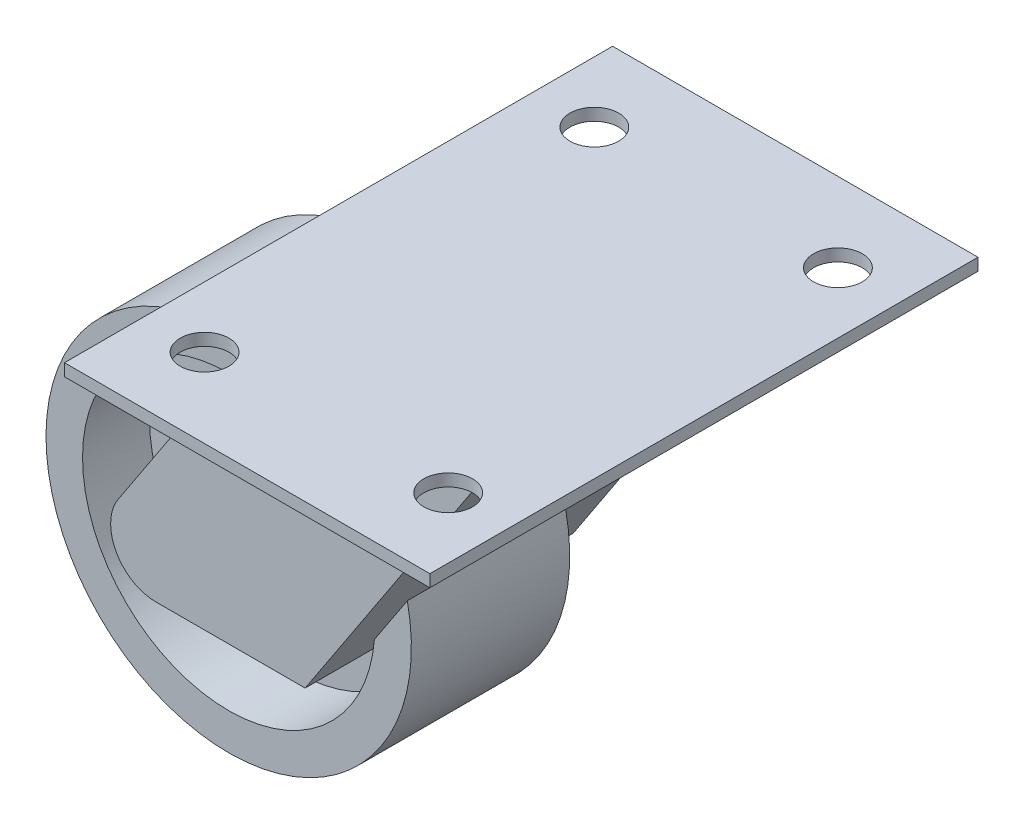
ISO-10303-21;
HEADER;
FILE_DESCRIPTION(('STEP AP214'),'2;1');
FILE_NAME('part.step','',(''),(''),'','','');
FILE_SCHEMA(('AUTOMOTIVE_DESIGN { 1 0 10303 214 1 1 1 1 }'));
ENDSEC;
DATA;
#1=APPLICATION_CONTEXT('core data for automotive mechanical design processes');
#2=APPLICATION_PROTOCOL_DEFINITION('international standard','automotive_design',2000,#1);
#3=PRODUCT_CONTEXT('',#1,'mechanical');
#4=PRODUCT('Part','Part','',(#3));
#5=PRODUCT_RELATED_PRODUCT_CATEGORY('part','',(#4));
#6=PRODUCT_DEFINITION_FORMATION('','',#4);
#7=PRODUCT_DEFINITION_CONTEXT('part definition',#1,'design');
#8=PRODUCT_DEFINITION('design','',#6,#7);
#9=PRODUCT_DEFINITION_SHAPE('','',#8);
#10=(LENGTH_UNIT() NAMED_UNIT(*) SI_UNIT(.MILLI.,.METRE.));
#11=(NAMED_UNIT(*) PLANE_ANGLE_UNIT() SI_UNIT($,.RADIAN.));
#12=(NAMED_UNIT(*) SI_UNIT($,.STERADIAN.) SOLID_ANGLE_UNIT());
#13=UNCERTAINTY_MEASURE_WITH_UNIT(LENGTH_MEASURE(1.E-05),#10,'distance_accuracy_value','');
#14=(GEOMETRIC_REPRESENTATION_CONTEXT(3) GLOBAL_UNCERTAINTY_ASSIGNED_CONTEXT((#13)) GLOBAL_UNIT_ASSIGNED_CONTEXT((#10,
#11,#12)) REPRESENTATION_CONTEXT('',''));
#15=CARTESIAN_POINT('',(0.,0.,0.));
#16=DIRECTION('',(0.,0.,1.));
#17=DIRECTION('',(1.,0.,0.));
#18=AXIS2_PLACEMENT_3D('',#15,#16,#17);
#19=CARTESIAN_POINT('',(10.7769033072078,-2.75667119831269,-11.));
#20=DIRECTION('',(0.835073819861632,-0.550137905785179,0.));
#21=DIRECTION('',(0.550137905785179,0.835073819861632,0.));
#22=AXIS2_PLACEMENT_3D('',#19,#20,#21);
#23=PLANE('',#22);
#24=DIRECTION('',(0.550137905785179,0.835073819861632,0.));
#25=VECTOR('',#24,1.);
#26=CARTESIAN_POINT('',(10.7769033072078,-2.75667119831269,-11.));
#27=LINE('',#26,#25);
#28=CARTESIAN_POINT('',(10.7769033072078,-2.75667119831269,-11.));
#29=VERTEX_POINT('',#28);
#30=CARTESIAN_POINT('',(26.4275500292333,21.,-11.));
#31=VERTEX_POINT('',#30);
#32=EDGE_CURVE('E278',#29,#31,#27,.T.);
#33=ORIENTED_EDGE('',*,*,#32,.T.);
#34=DIRECTION('',(0.,0.,1.));
#35=VECTOR('',#34,1.);
#36=CARTESIAN_POINT('',(26.4275500292333,21.,-11.));
#37=LINE('',#36,#35);
#38=CARTESIAN_POINT('',(26.4275500292333,21.,11.));
#39=VERTEX_POINT('',#38);
#40=EDGE_CURVE('E259',#31,#39,#37,.T.);
#41=ORIENTED_EDGE('',*,*,#40,.T.);
#42=DIRECTION('',(0.550137905785179,0.835073819861632,0.));
#43=VECTOR('',#42,1.);
#44=CARTESIAN_POINT('',(10.7769033072078,-2.75667119831269,11.));
#45=LINE('',#44,#43);
#46=CARTESIAN_POINT('',(10.7769033072078,-2.75667119831269,11.));
#47=VERTEX_POINT('',#46);
#48=EDGE_CURVE('E271',#47,#39,#45,.T.);
#49=ORIENTED_EDGE('',*,*,#48,.F.);
#50=DIRECTION('',(0.,0.,1.));
#51=VECTOR('',#50,1.);
#52=CARTESIAN_POINT('',(10.7769033072078,-2.75667119831269,-11.));
#53=LINE('',#52,#51);
#54=CARTESIAN_POINT('',(10.7769033072078,-2.75667119831269,1.));
#55=VERTEX_POINT('',#54);
#56=EDGE_CURVE('E301',#55,#47,#53,.T.);
#57=ORIENTED_EDGE('',*,*,#56,.F.);
#58=DIRECTION('',(0.550137905785179,0.835073819861632,0.));
#59=VECTOR('',#58,1.);
#60=CARTESIAN_POINT('',(8.78168566842124,-5.78528274744558,1.));
#61=LINE('',#60,#59);
#62=CARTESIAN_POINT('',(11.9616778927944,-0.958259875521329,1.));
#63=VERTEX_POINT('',#62);
#64=EDGE_CURVE('E59',#55,#63,#61,.T.);
#65=ORIENTED_EDGE('',*,*,#64,.T.);
#66=DIRECTION('',(0.,0.,-1.));
#67=VECTOR('',#66,1.);
#68=CARTESIAN_POINT('',(11.9616778927944,-0.958259875521333,6.5));
#69=LINE('',#68,#67);
#70=CARTESIAN_POINT('',(11.9616778927944,-0.958259875521333,6.5));
#71=VERTEX_POINT('',#70);
#72=EDGE_CURVE('E365',#63,#71,#69,.F.);
#73=ORIENTED_EDGE('',*,*,#72,.T.);
#74=DIRECTION('',(0.550137905785179,0.835073819861632,0.));
#75=VECTOR('',#74,1.);
#76=CARTESIAN_POINT('',(8.78168566842124,-5.78528274744558,6.5));
#77=LINE('',#76,#75);
#78=CARTESIAN_POINT('',(14.666168610277,3.14698241096535,6.5));
#79=VERTEX_POINT('',#78);
#80=EDGE_CURVE('E368',#71,#79,#77,.T.);
#81=ORIENTED_EDGE('',*,*,#80,.T.);
#82=DIRECTION('',(0.,0.,-1.));
#83=VECTOR('',#82,1.);
#84=CARTESIAN_POINT('',(14.666168610277,3.14698241096535,6.5));
#85=LINE('',#84,#83);
#86=CARTESIAN_POINT('',(14.666168610277,3.14698241096535,-6.5));
#87=VERTEX_POINT('',#86);
#88=EDGE_CURVE('E371',#87,#79,#85,.F.);
#89=ORIENTED_EDGE('',*,*,#88,.F.);
#90=DIRECTION('',(0.550137905785179,0.835073819861632,0.));
#91=VECTOR('',#90,1.);
#92=CARTESIAN_POINT('',(8.78168566842124,-5.78528274744558,-6.5));
#93=LINE('',#92,#91);
#94=CARTESIAN_POINT('',(11.9616778927944,-0.958259875521329,-6.5));
#95=VERTEX_POINT('',#94);
#96=EDGE_CURVE('E375',#95,#87,#93,.T.);
#97=ORIENTED_EDGE('',*,*,#96,.F.);
#98=DIRECTION('',(0.,0.,-1.));
#99=VECTOR('',#98,1.);
#100=CARTESIAN_POINT('',(11.9616778927944,-0.958259875521333,6.5));
#101=LINE('',#100,#99);
#102=CARTESIAN_POINT('',(11.9616778927944,-0.958259875521333,-1.));
#103=VERTEX_POINT('',#102);
#104=EDGE_CURVE('E379',#95,#103,#101,.F.);
#105=ORIENTED_EDGE('',*,*,#104,.T.);
#106=DIRECTION('',(0.550137905785179,0.835073819861632,0.));
#107=VECTOR('',#106,1.);
#108=CARTESIAN_POINT('',(8.78168566842124,-5.78528274744558,-1.));
#109=LINE('',#108,#107);
#110=CARTESIAN_POINT('',(10.7769033072078,-2.75667119831269,-1.));
#111=VERTEX_POINT('',#110);
#112=EDGE_CURVE('E382',#111,#103,#109,.T.);
#113=ORIENTED_EDGE('',*,*,#112,.F.);
#114=EDGE_CURVE('E296',#29,#111,#53,.T.);
#115=ORIENTED_EDGE('',*,*,#114,.F.);
#116=EDGE_LOOP('',(#33,#41,#49,#57,#65,#73,#81,#89,#97,#105,#113,#115));
#117=FACE_BOUND('',#116,.T.);
#118=ADVANCED_FACE('F50',(#117),#23,.T.);
#119=CARTESIAN_POINT('',(-4.58185860778798,2.97795286723007,-11.));
#120=DIRECTION('',(-0.835073819861632,0.550137905785179,0.));
#121=DIRECTION('',(-0.550137905785179,-0.835073819861632,0.));
#122=AXIS2_PLACEMENT_3D('',#119,#120,#121);
#123=PLANE('',#122);
#124=DIRECTION('',(-0.550137905785179,-0.835073819861632,0.));
#125=VECTOR('',#124,1.);
#126=CARTESIAN_POINT('',(-4.58185860778798,2.97795286723007,11.));
#127=LINE('',#126,#125);
#128=CARTESIAN_POINT('',(7.29087770817826,21.,11.));
#129=VERTEX_POINT('',#128);
#130=CARTESIAN_POINT('',(-4.58185860778798,2.97795286723007,11.));
#131=VERTEX_POINT('',#130);
#132=EDGE_CURVE('E266',#129,#131,#127,.T.);
#133=ORIENTED_EDGE('',*,*,#132,.F.);
#134=DIRECTION('',(0.,0.,-1.));
#135=VECTOR('',#134,1.);
#136=CARTESIAN_POINT('',(7.29087770817826,21.,-11.));
#137=LINE('',#136,#135);
#138=CARTESIAN_POINT('',(7.29087770817826,21.,-11.));
#139=VERTEX_POINT('',#138);
#140=EDGE_CURVE('E66',#129,#139,#137,.T.);
#141=ORIENTED_EDGE('',*,*,#140,.T.);
#142=DIRECTION('',(-0.550137905785179,-0.835073819861632,0.));
#143=VECTOR('',#142,1.);
#144=CARTESIAN_POINT('',(-4.58185860778798,2.97795286723007,-11.));
#145=LINE('',#144,#143);
#146=CARTESIAN_POINT('',(-4.58185860778798,2.97795286723007,-11.));
#147=VERTEX_POINT('',#146);
#148=EDGE_CURVE('E267',#139,#147,#145,.T.);
#149=ORIENTED_EDGE('',*,*,#148,.T.);
#150=DIRECTION('',(0.,0.,1.));
#151=VECTOR('',#150,1.);
#152=CARTESIAN_POINT('',(-4.58185860778798,2.97795286723007,-11.));
#153=LINE('',#152,#151);
#154=CARTESIAN_POINT('',(-4.58185860778798,2.97795286723007,-1.));
#155=VERTEX_POINT('',#154);
#156=EDGE_CURVE('E305',#147,#155,#153,.T.);
#157=ORIENTED_EDGE('',*,*,#156,.T.);
#158=DIRECTION('',(-0.550137905785179,-0.835073819861632,0.));
#159=VECTOR('',#158,1.);
#160=CARTESIAN_POINT('',(-4.56323994796898,3.00621479067191,-1.));
#161=LINE('',#160,#159);
#162=CARTESIAN_POINT('',(1.31421865650546,11.927817458483,-1.));
#163=VERTEX_POINT('',#162);
#164=EDGE_CURVE('E361',#163,#155,#161,.T.);
#165=ORIENTED_EDGE('',*,*,#164,.F.);
#166=DIRECTION('',(0.,0.,-1.));
#167=VECTOR('',#166,1.);
#168=CARTESIAN_POINT('',(1.31421865650546,11.927817458483,6.5));
#169=LINE('',#168,#167);
#170=CARTESIAN_POINT('',(1.31421865650547,11.927817458483,-6.5));
#171=VERTEX_POINT('',#170);
#172=EDGE_CURVE('E358',#163,#171,#169,.T.);
#173=ORIENTED_EDGE('',*,*,#172,.T.);
#174=DIRECTION('',(-0.550137905785179,-0.835073819861632,0.));
#175=VECTOR('',#174,1.);
#176=CARTESIAN_POINT('',(-4.56323994796898,3.00621479067191,-6.5));
#177=LINE('',#176,#175);
#178=CARTESIAN_POINT('',(3.12176549075575,14.6715568437956,-6.5));
#179=VERTEX_POINT('',#178);
#180=EDGE_CURVE('E354',#179,#171,#177,.T.);
#181=ORIENTED_EDGE('',*,*,#180,.F.);
#182=DIRECTION('',(0.,0.,-1.));
#183=VECTOR('',#182,1.);
#184=CARTESIAN_POINT('',(3.12176549075575,14.6715568437956,6.5));
#185=LINE('',#184,#183);
#186=CARTESIAN_POINT('',(3.12176549075575,14.6715568437956,6.5));
#187=VERTEX_POINT('',#186);
#188=EDGE_CURVE('E350',#187,#179,#185,.T.);
#189=ORIENTED_EDGE('',*,*,#188,.F.);
#190=DIRECTION('',(-0.550137905785179,-0.835073819861632,0.));
#191=VECTOR('',#190,1.);
#192=CARTESIAN_POINT('',(-4.56323994796898,3.00621479067191,6.5));
#193=LINE('',#192,#191);
#194=CARTESIAN_POINT('',(1.31421865650546,11.927817458483,6.5));
#195=VERTEX_POINT('',#194);
#196=EDGE_CURVE('E347',#187,#195,#193,.T.);
#197=ORIENTED_EDGE('',*,*,#196,.T.);
#198=DIRECTION('',(0.,0.,-1.));
#199=VECTOR('',#198,1.);
#200=CARTESIAN_POINT('',(1.31421865650546,11.927817458483,6.5));
#201=LINE('',#200,#199);
#202=CARTESIAN_POINT('',(1.31421865650547,11.927817458483,1.));
#203=VERTEX_POINT('',#202);
#204=EDGE_CURVE('E344',#195,#203,#201,.T.);
#205=ORIENTED_EDGE('',*,*,#204,.T.);
#206=DIRECTION('',(-0.550137905785179,-0.835073819861632,0.));
#207=VECTOR('',#206,1.);
#208=CARTESIAN_POINT('',(-4.56323994796898,3.00621479067191,1.));
#209=LINE('',#208,#207);
#210=CARTESIAN_POINT('',(-4.58185860778798,2.97795286723007,1.));
#211=VERTEX_POINT('',#210);
#212=EDGE_CURVE('E434',#203,#211,#209,.T.);
#213=ORIENTED_EDGE('',*,*,#212,.T.);
#214=EDGE_CURVE('E282',#211,#131,#153,.T.);
#215=ORIENTED_EDGE('',*,*,#214,.T.);
#216=EDGE_LOOP('',(#133,#141,#149,#157,#165,#173,#181,#189,#197,#205,#213,#215));
#217=FACE_BOUND('',#216,.T.);
#218=ADVANCED_FACE('F457',(#217),#123,.T.);
#219=CARTESIAN_POINT('',(0.,0.,-11.));
#220=DIRECTION('',(0.,0.,1.));
#221=DIRECTION('',(1.,0.,0.));
#222=AXIS2_PLACEMENT_3D('',#219,#220,#221);
#223=PLANE('',#222);
#224=DIRECTION('',(-1.,0.,0.));
#225=VECTOR('',#224,1.);
#226=CARTESIAN_POINT('',(0.,21.,-11.));
#227=LINE('',#226,#225);
#228=EDGE_CURVE('E263',#31,#139,#227,.T.);
#229=ORIENTED_EDGE('',*,*,#228,.F.);
#230=ORIENTED_EDGE('',*,*,#32,.F.);
#231=DIRECTION('',(1.,0.,0.));
#232=VECTOR('',#231,1.);
#233=CARTESIAN_POINT('',(-1.49256287093057,-2.75667119831269,-11.));
#234=LINE('',#233,#232);
#235=CARTESIAN_POINT('',(-1.49256287093057,-2.75667119831269,-11.));
#236=VERTEX_POINT('',#235);
#237=EDGE_CURVE('E274',#236,#29,#234,.T.);
#238=ORIENTED_EDGE('',*,*,#237,.F.);
#239=CARTESIAN_POINT('',(-1.49256287093057,0.94275711973624,-11.));
#240=DIRECTION('',(0.,0.,1.));
#241=DIRECTION('',(-1.,0.,0.));
#242=AXIS2_PLACEMENT_3D('',#239,#240,#241);
#243=CIRCLE('',#242,3.69942831804893);
#244=EDGE_CURVE('E270',#147,#236,#243,.T.);
#245=ORIENTED_EDGE('',*,*,#244,.F.);
#246=ORIENTED_EDGE('',*,*,#148,.F.);
#247=EDGE_LOOP('',(#229,#230,#238,#245,#246));
#248=FACE_BOUND('',#247,.T.);
#249=ADVANCED_FACE('F474',(#248),#223,.F.);
#250=CARTESIAN_POINT('',(0.,0.,11.));
#251=DIRECTION('',(0.,0.,1.));
#252=DIRECTION('',(1.,0.,0.));
#253=AXIS2_PLACEMENT_3D('',#250,#251,#252);
#254=PLANE('',#253);
#255=ORIENTED_EDGE('',*,*,#48,.T.);
#256=DIRECTION('',(-1.,0.,0.));
#257=VECTOR('',#256,1.);
#258=CARTESIAN_POINT('',(0.,21.,11.));
#259=LINE('',#258,#257);
#260=EDGE_CURVE('E12',#39,#129,#259,.T.);
#261=ORIENTED_EDGE('',*,*,#260,.T.);
#262=ORIENTED_EDGE('',*,*,#132,.T.);
#263=CARTESIAN_POINT('',(-1.49256287093057,0.94275711973624,11.));
#264=DIRECTION('',(0.,0.,1.));
#265=DIRECTION('',(-1.,0.,0.));
#266=AXIS2_PLACEMENT_3D('',#263,#264,#265);
#267=CIRCLE('',#266,3.69942831804893);
#268=CARTESIAN_POINT('',(-1.49256287093057,-2.75667119831269,11.));
#269=VERTEX_POINT('',#268);
#270=EDGE_CURVE('E285',#131,#269,#267,.T.);
#271=ORIENTED_EDGE('',*,*,#270,.T.);
#272=DIRECTION('',(1.,0.,0.));
#273=VECTOR('',#272,1.);
#274=CARTESIAN_POINT('',(-1.49256287093057,-2.75667119831269,11.));
#275=LINE('',#274,#273);
#276=EDGE_CURVE('E289',#269,#47,#275,.T.);
#277=ORIENTED_EDGE('',*,*,#276,.T.);
#278=EDGE_LOOP('',(#255,#261,#262,#271,#277));
#279=FACE_BOUND('',#278,.T.);
#280=ADVANCED_FACE('F469',(#279),#254,.T.);
#281=CARTESIAN_POINT('',(0.,0.,6.5));
#282=DIRECTION('',(0.,0.,-1.));
#283=DIRECTION('',(-1.,0.,0.));
#284=AXIS2_PLACEMENT_3D('',#281,#282,#283);
#285=CYLINDRICAL_SURFACE('',#284,12.);
#286=ORIENTED_EDGE('',*,*,#104,.F.);
#287=CARTESIAN_POINT('',(0.,0.,-6.5));
#288=DIRECTION('',(0.,0.,1.));
#289=DIRECTION('',(1.,0.,0.));
#290=AXIS2_PLACEMENT_3D('',#287,#288,#289);
#291=CIRCLE('',#290,12.);
#292=EDGE_CURVE('E406',#171,#95,#291,.T.);
#293=ORIENTED_EDGE('',*,*,#292,.F.);
#294=ORIENTED_EDGE('',*,*,#172,.F.);
#295=CARTESIAN_POINT('',(0.,0.,-1.));
#296=DIRECTION('',(0.,0.,1.));
#297=DIRECTION('',(1.,0.,0.));
#298=AXIS2_PLACEMENT_3D('',#295,#296,#297);
#299=CIRCLE('',#298,12.);
#300=EDGE_CURVE('E410',#163,#103,#299,.T.);
#301=ORIENTED_EDGE('',*,*,#300,.T.);
#302=EDGE_LOOP('',(#286,#293,#294,#301));
#303=FACE_BOUND('',#302,.T.);
#304=ADVANCED_FACE('F519',(#303),#285,.F.);
#305=CARTESIAN_POINT('',(0.,0.,6.5));
#306=DIRECTION('',(0.,0.,1.));
#307=DIRECTION('',(1.,0.,0.));
#308=AXIS2_PLACEMENT_3D('',#305,#306,#307);
#309=PLANE('',#308);
#310=ORIENTED_EDGE('',*,*,#80,.F.);
#311=CARTESIAN_POINT('',(0.,0.,6.5));
#312=DIRECTION('',(0.,0.,1.));
#313=DIRECTION('',(1.,0.,0.));
#314=AXIS2_PLACEMENT_3D('',#311,#312,#313);
#315=CIRCLE('',#314,12.);
#316=EDGE_CURVE('E401',#195,#71,#315,.T.);
#317=ORIENTED_EDGE('',*,*,#316,.F.);
#318=ORIENTED_EDGE('',*,*,#196,.F.);
#319=CARTESIAN_POINT('',(0.,0.,6.5));
#320=DIRECTION('',(0.,0.,1.));
#321=DIRECTION('',(1.,0.,0.));
#322=AXIS2_PLACEMENT_3D('',#319,#320,#321);
#323=CIRCLE('',#322,15.);
#324=EDGE_CURVE('E411',#187,#79,#323,.T.);
#325=ORIENTED_EDGE('',*,*,#324,.T.);
#326=EDGE_LOOP('',(#310,#317,#318,#325));
#327=FACE_BOUND('',#326,.T.);
#328=ADVANCED_FACE('F541',(#327),#309,.T.);
#329=CARTESIAN_POINT('',(0.,0.,-6.5));
#330=DIRECTION('',(0.,0.,1.));
#331=DIRECTION('',(1.,0.,0.));
#332=AXIS2_PLACEMENT_3D('',#329,#330,#331);
#333=PLANE('',#332);
#334=ORIENTED_EDGE('',*,*,#292,.T.);
#335=ORIENTED_EDGE('',*,*,#96,.T.);
#336=CARTESIAN_POINT('',(0.,0.,-6.5));
#337=DIRECTION('',(0.,0.,1.));
#338=DIRECTION('',(1.,0.,0.));
#339=AXIS2_PLACEMENT_3D('',#336,#337,#338);
#340=CIRCLE('',#339,15.);
#341=EDGE_CURVE('E405',#179,#87,#340,.T.);
#342=ORIENTED_EDGE('',*,*,#341,.F.);
#343=ORIENTED_EDGE('',*,*,#180,.T.);
#344=EDGE_LOOP('',(#334,#335,#342,#343));
#345=FACE_BOUND('',#344,.T.);
#346=ADVANCED_FACE('F543',(#345),#333,.F.);
#347=CARTESIAN_POINT('',(0.,0.,6.5));
#348=DIRECTION('',(0.,0.,-1.));
#349=DIRECTION('',(-1.,0.,0.));
#350=AXIS2_PLACEMENT_3D('',#347,#348,#349);
#351=CYLINDRICAL_SURFACE('',#350,15.);
#352=ORIENTED_EDGE('',*,*,#341,.T.);
#353=ORIENTED_EDGE('',*,*,#88,.T.);
#354=ORIENTED_EDGE('',*,*,#324,.F.);
#355=ORIENTED_EDGE('',*,*,#188,.T.);
#356=EDGE_LOOP('',(#352,#353,#354,#355));
#357=FACE_BOUND('',#356,.T.);
#358=ADVANCED_FACE('F52',(#357),#351,.T.);
#359=ORIENTED_EDGE('',*,*,#72,.F.);
#360=CARTESIAN_POINT('',(0.,0.,1.));
#361=DIRECTION('',(0.,0.,1.));
#362=DIRECTION('',(1.,0.,0.));
#363=AXIS2_PLACEMENT_3D('',#360,#361,#362);
#364=CIRCLE('',#363,12.);
#365=EDGE_CURVE('E400',#203,#63,#364,.T.);
#366=ORIENTED_EDGE('',*,*,#365,.F.);
#367=ORIENTED_EDGE('',*,*,#204,.F.);
#368=ORIENTED_EDGE('',*,*,#316,.T.);
#369=EDGE_LOOP('',(#359,#366,#367,#368));
#370=FACE_BOUND('',#369,.T.);
#371=ADVANCED_FACE('F447',(#370),#285,.F.);
#372=CARTESIAN_POINT('',(0.,0.,-1.));
#373=DIRECTION('',(0.,0.,1.));
#374=DIRECTION('',(1.,0.,0.));
#375=AXIS2_PLACEMENT_3D('',#372,#373,#374);
#376=PLANE('',#375);
#377=DIRECTION('',(1.,0.,0.));
#378=VECTOR('',#377,1.);
#379=CARTESIAN_POINT('',(0.,-2.75667119831269,-1.));
#380=LINE('',#379,#378);
#381=CARTESIAN_POINT('',(4.17142228794847,-2.75667119831269,-1.));
#382=VERTEX_POINT('',#381);
#383=EDGE_CURVE('E330',#382,#111,#380,.T.);
#384=ORIENTED_EDGE('',*,*,#383,.T.);
#385=ORIENTED_EDGE('',*,*,#112,.T.);
#386=ORIENTED_EDGE('',*,*,#300,.F.);
#387=ORIENTED_EDGE('',*,*,#164,.T.);
#388=CARTESIAN_POINT('',(-1.49256287093057,0.94275711973624,-1.));
#389=DIRECTION('',(0.,0.,1.));
#390=DIRECTION('',(1.,0.,0.));
#391=AXIS2_PLACEMENT_3D('',#388,#389,#390);
#392=CIRCLE('',#391,3.69942831804893);
#393=CARTESIAN_POINT('',(-4.99362707825869,-0.252366010551265,-1.));
#394=VERTEX_POINT('',#393);
#395=EDGE_CURVE('E312',#155,#394,#392,.T.);
#396=ORIENTED_EDGE('',*,*,#395,.T.);
#397=CARTESIAN_POINT('',(0.,0.,-1.));
#398=DIRECTION('',(0.,0.,1.));
#399=DIRECTION('',(1.,0.,0.));
#400=AXIS2_PLACEMENT_3D('',#397,#398,#399);
#401=CIRCLE('',#400,5.);
#402=EDGE_CURVE('E395',#382,#394,#401,.F.);
#403=ORIENTED_EDGE('',*,*,#402,.F.);
#404=EDGE_LOOP('',(#384,#385,#386,#387,#396,#403));
#405=FACE_BOUND('',#404,.T.);
#406=ADVANCED_FACE('F481',(#405),#376,.F.);
#407=CARTESIAN_POINT('',(0.,0.,1.));
#408=DIRECTION('',(0.,0.,1.));
#409=DIRECTION('',(1.,0.,0.));
#410=AXIS2_PLACEMENT_3D('',#407,#408,#409);
#411=PLANE('',#410);
#412=ORIENTED_EDGE('',*,*,#64,.F.);
#413=DIRECTION('',(1.,0.,0.));
#414=VECTOR('',#413,1.);
#415=CARTESIAN_POINT('',(0.,-2.75667119831269,1.));
#416=LINE('',#415,#414);
#417=CARTESIAN_POINT('',(4.17142228794847,-2.75667119831269,1.));
#418=VERTEX_POINT('',#417);
#419=EDGE_CURVE('E341',#418,#55,#416,.T.);
#420=ORIENTED_EDGE('',*,*,#419,.F.);
#421=CARTESIAN_POINT('',(0.,0.,1.));
#422=DIRECTION('',(0.,0.,1.));
#423=DIRECTION('',(1.,0.,0.));
#424=AXIS2_PLACEMENT_3D('',#421,#422,#423);
#425=CIRCLE('',#424,5.);
#426=CARTESIAN_POINT('',(-4.99362707825869,-0.252366010551265,1.));
#427=VERTEX_POINT('',#426);
#428=EDGE_CURVE('E391',#418,#427,#425,.F.);
#429=ORIENTED_EDGE('',*,*,#428,.T.);
#430=CARTESIAN_POINT('',(-1.49256287093057,0.94275711973624,1.));
#431=DIRECTION('',(0.,0.,1.));
#432=DIRECTION('',(1.,0.,0.));
#433=AXIS2_PLACEMENT_3D('',#430,#431,#432);
#434=CIRCLE('',#433,3.69942831804893);
#435=EDGE_CURVE('E323',#211,#427,#434,.T.);
#436=ORIENTED_EDGE('',*,*,#435,.F.);
#437=ORIENTED_EDGE('',*,*,#212,.F.);
#438=ORIENTED_EDGE('',*,*,#365,.T.);
#439=EDGE_LOOP('',(#412,#420,#429,#436,#437,#438));
#440=FACE_BOUND('',#439,.T.);
#441=ADVANCED_FACE('F451',(#440),#411,.T.);
#442=CARTESIAN_POINT('',(0.,0.,6.5));
#443=DIRECTION('',(0.,0.,1.));
#444=DIRECTION('',(1.,0.,0.));
#445=AXIS2_PLACEMENT_3D('',#442,#443,#444);
#446=PLANE('',#445);
#447=DIRECTION('',(1.,0.,0.));
#448=VECTOR('',#447,1.);
#449=CARTESIAN_POINT('',(0.,-2.75667119831269,6.5));
#450=LINE('',#449,#448);
#451=CARTESIAN_POINT('',(-1.49256287093057,-2.75667119831269,6.5));
#452=VERTEX_POINT('',#451);
#453=CARTESIAN_POINT('',(4.17142228794847,-2.75667119831269,6.5));
#454=VERTEX_POINT('',#453);
#455=EDGE_CURVE('E338',#452,#454,#450,.T.);
#456=ORIENTED_EDGE('',*,*,#455,.F.);
#457=CARTESIAN_POINT('',(-1.49256287093057,0.94275711973624,6.5));
#458=DIRECTION('',(0.,0.,1.));
#459=DIRECTION('',(1.,0.,0.));
#460=AXIS2_PLACEMENT_3D('',#457,#458,#459);
#461=CIRCLE('',#460,3.69942831804893);
#462=CARTESIAN_POINT('',(-4.99362707825869,-0.252366010551265,6.5));
#463=VERTEX_POINT('',#462);
#464=EDGE_CURVE('E320',#463,#452,#461,.T.);
#465=ORIENTED_EDGE('',*,*,#464,.F.);
#466=CARTESIAN_POINT('',(0.,0.,6.5));
#467=DIRECTION('',(0.,0.,1.));
#468=DIRECTION('',(1.,0.,0.));
#469=AXIS2_PLACEMENT_3D('',#466,#467,#468);
#470=CIRCLE('',#469,5.);
#471=EDGE_CURVE('E387',#463,#454,#470,.T.);
#472=ORIENTED_EDGE('',*,*,#471,.T.);
#473=EDGE_LOOP('',(#456,#465,#472));
#474=FACE_BOUND('',#473,.T.);
#475=ADVANCED_FACE('F521',(#474),#446,.T.);
#476=CARTESIAN_POINT('',(0.,0.,6.5));
#477=DIRECTION('',(0.,0.,-1.));
#478=DIRECTION('',(-1.,0.,0.));
#479=AXIS2_PLACEMENT_3D('',#476,#477,#478);
#480=CYLINDRICAL_SURFACE('',#479,5.);
#481=ORIENTED_EDGE('',*,*,#428,.F.);
#482=DIRECTION('',(0.,0.,-1.));
#483=VECTOR('',#482,1.);
#484=CARTESIAN_POINT('',(4.17142228794847,-2.75667119831269,6.5));
#485=LINE('',#484,#483);
#486=EDGE_CURVE('E334',#418,#454,#485,.F.);
#487=ORIENTED_EDGE('',*,*,#486,.T.);
#488=ORIENTED_EDGE('',*,*,#471,.F.);
#489=DIRECTION('',(0.,0.,1.));
#490=VECTOR('',#489,1.);
#491=CARTESIAN_POINT('',(-4.99362707825869,-0.252366010551265,0.));
#492=LINE('',#491,#490);
#493=EDGE_CURVE('E316',#463,#427,#492,.F.);
#494=ORIENTED_EDGE('',*,*,#493,.T.);
#495=EDGE_LOOP('',(#481,#487,#488,#494));
#496=FACE_BOUND('',#495,.T.);
#497=ADVANCED_FACE('F497',(#496),#480,.T.);
#498=CARTESIAN_POINT('',(0.,0.,-6.5));
#499=DIRECTION('',(0.,0.,1.));
#500=DIRECTION('',(1.,0.,0.));
#501=AXIS2_PLACEMENT_3D('',#498,#499,#500);
#502=CIRCLE('',#501,5.);
#503=CARTESIAN_POINT('',(-4.99362707825869,-0.252366010551265,-6.5));
#504=VERTEX_POINT('',#503);
#505=CARTESIAN_POINT('',(4.17142228794848,-2.75667119831269,-6.5));
#506=VERTEX_POINT('',#505);
#507=EDGE_CURVE('E386',#504,#506,#502,.T.);
#508=ORIENTED_EDGE('',*,*,#507,.T.);
#509=DIRECTION('',(0.,0.,-1.));
#510=VECTOR('',#509,1.);
#511=CARTESIAN_POINT('',(4.17142228794847,-2.75667119831269,6.5));
#512=LINE('',#511,#510);
#513=EDGE_CURVE('E326',#506,#382,#512,.F.);
#514=ORIENTED_EDGE('',*,*,#513,.T.);
#515=ORIENTED_EDGE('',*,*,#402,.T.);
#516=DIRECTION('',(0.,0.,1.));
#517=VECTOR('',#516,1.);
#518=CARTESIAN_POINT('',(-4.99362707825869,-0.252366010551265,0.));
#519=LINE('',#518,#517);
#520=EDGE_CURVE('E300',#394,#504,#519,.F.);
#521=ORIENTED_EDGE('',*,*,#520,.T.);
#522=EDGE_LOOP('',(#508,#514,#515,#521));
#523=FACE_BOUND('',#522,.T.);
#524=ADVANCED_FACE('F484',(#523),#480,.T.);
#525=CARTESIAN_POINT('',(0.,0.,-6.5));
#526=DIRECTION('',(0.,0.,1.));
#527=DIRECTION('',(1.,0.,0.));
#528=AXIS2_PLACEMENT_3D('',#525,#526,#527);
#529=PLANE('',#528);
#530=CARTESIAN_POINT('',(-1.49256287093057,0.94275711973624,-6.5));
#531=DIRECTION('',(0.,0.,1.));
#532=DIRECTION('',(1.,0.,0.));
#533=AXIS2_PLACEMENT_3D('',#530,#531,#532);
#534=CIRCLE('',#533,3.69942831804893);
#535=CARTESIAN_POINT('',(-1.49256287093057,-2.75667119831269,-6.5));
#536=VERTEX_POINT('',#535);
#537=EDGE_CURVE('E399',#504,#536,#534,.T.);
#538=ORIENTED_EDGE('',*,*,#537,.T.);
#539=DIRECTION('',(1.,0.,0.));
#540=VECTOR('',#539,1.);
#541=CARTESIAN_POINT('',(0.,-2.75667119831269,-6.5));
#542=LINE('',#541,#540);
#543=EDGE_CURVE('E430',#536,#506,#542,.T.);
#544=ORIENTED_EDGE('',*,*,#543,.T.);
#545=ORIENTED_EDGE('',*,*,#507,.F.);
#546=EDGE_LOOP('',(#538,#544,#545));
#547=FACE_BOUND('',#546,.T.);
#548=ADVANCED_FACE('F489',(#547),#529,.F.);
#549=CARTESIAN_POINT('',(-1.49256287093057,-2.75667119831269,-11.));
#550=DIRECTION('',(0.,-1.,0.));
#551=DIRECTION('',(0.,0.,-1.));
#552=AXIS2_PLACEMENT_3D('',#549,#550,#551);
#553=PLANE('',#552);
#554=ORIENTED_EDGE('',*,*,#383,.F.);
#555=ORIENTED_EDGE('',*,*,#513,.F.);
#556=ORIENTED_EDGE('',*,*,#543,.F.);
#557=DIRECTION('',(0.,0.,1.));
#558=VECTOR('',#557,1.);
#559=CARTESIAN_POINT('',(-1.49256287093057,-2.75667119831269,-11.));
#560=LINE('',#559,#558);
#561=EDGE_CURVE('E73',#236,#536,#560,.T.);
#562=ORIENTED_EDGE('',*,*,#561,.F.);
#563=ORIENTED_EDGE('',*,*,#237,.T.);
#564=ORIENTED_EDGE('',*,*,#114,.T.);
#565=EDGE_LOOP('',(#554,#555,#556,#562,#563,#564));
#566=FACE_BOUND('',#565,.T.);
#567=ADVANCED_FACE('F487',(#566),#553,.T.);
#568=CARTESIAN_POINT('',(-1.49256287093057,0.94275711973624,-11.));
#569=DIRECTION('',(0.,0.,1.));
#570=DIRECTION('',(1.,0.,0.));
#571=AXIS2_PLACEMENT_3D('',#568,#569,#570);
#572=CYLINDRICAL_SURFACE('',#571,3.69942831804893);
#573=ORIENTED_EDGE('',*,*,#395,.F.);
#574=ORIENTED_EDGE('',*,*,#156,.F.);
#575=ORIENTED_EDGE('',*,*,#244,.T.);
#576=ORIENTED_EDGE('',*,*,#561,.T.);
#577=ORIENTED_EDGE('',*,*,#537,.F.);
#578=ORIENTED_EDGE('',*,*,#520,.F.);
#579=EDGE_LOOP('',(#573,#574,#575,#576,#577,#578));
#580=FACE_BOUND('',#579,.T.);
#581=ADVANCED_FACE('F478',(#580),#572,.T.);
#582=ORIENTED_EDGE('',*,*,#486,.F.);
#583=ORIENTED_EDGE('',*,*,#419,.T.);
#584=ORIENTED_EDGE('',*,*,#56,.T.);
#585=ORIENTED_EDGE('',*,*,#276,.F.);
#586=EDGE_CURVE('E304',#452,#269,#560,.T.);
#587=ORIENTED_EDGE('',*,*,#586,.F.);
#588=ORIENTED_EDGE('',*,*,#455,.T.);
#589=EDGE_LOOP('',(#582,#583,#584,#585,#587,#588));
#590=FACE_BOUND('',#589,.T.);
#591=ADVANCED_FACE('F466',(#590),#553,.T.);
#592=ORIENTED_EDGE('',*,*,#214,.F.);
#593=ORIENTED_EDGE('',*,*,#435,.T.);
#594=ORIENTED_EDGE('',*,*,#493,.F.);
#595=ORIENTED_EDGE('',*,*,#464,.T.);
#596=ORIENTED_EDGE('',*,*,#586,.T.);
#597=ORIENTED_EDGE('',*,*,#270,.F.);
#598=EDGE_LOOP('',(#592,#593,#594,#595,#596,#597));
#599=FACE_BOUND('',#598,.T.);
#600=ADVANCED_FACE('F460',(#599),#572,.T.);
#601=CARTESIAN_POINT('',(0.,21.,0.));
#602=DIRECTION('',(0.,1.,0.));
#603=DIRECTION('',(0.,0.,1.));
#604=AXIS2_PLACEMENT_3D('',#601,#602,#603);
#605=PLANE('',#604);
#606=CARTESIAN_POINT('',(27.5196672579169,21.,16.));
#607=DIRECTION('',(0.,1.,0.));
#608=DIRECTION('',(0.,0.,-1.));
#609=AXIS2_PLACEMENT_3D('',#606,#607,#608);
#610=CIRCLE('',#609,2.);
#611=CARTESIAN_POINT('',(27.5196672579169,21.,14.));
#612=VERTEX_POINT('',#611);
#613=EDGE_CURVE('E843',#612,#612,#610,.T.);
#614=ORIENTED_EDGE('',*,*,#613,.T.);
#615=EDGE_LOOP('',(#614));
#616=FACE_BOUND('',#615,.T.);
#617=CARTESIAN_POINT('',(7.51966725791692,21.,16.));
#618=DIRECTION('',(0.,1.,0.));
#619=DIRECTION('',(0.,0.,1.));
#620=AXIS2_PLACEMENT_3D('',#617,#618,#619);
#621=CIRCLE('',#620,2.);
#622=CARTESIAN_POINT('',(7.51966725791692,21.,18.));
#623=VERTEX_POINT('',#622);
#624=EDGE_CURVE('E854',#623,#623,#621,.T.);
#625=ORIENTED_EDGE('',*,*,#624,.T.);
#626=EDGE_LOOP('',(#625));
#627=FACE_BOUND('',#626,.T.);
#628=CARTESIAN_POINT('',(7.51966725791692,21.,-16.));
#629=DIRECTION('',(0.,1.,0.));
#630=DIRECTION('',(0.,0.,-1.));
#631=AXIS2_PLACEMENT_3D('',#628,#629,#630);
#632=CIRCLE('',#631,2.);
#633=CARTESIAN_POINT('',(7.51966725791692,21.,-18.));
#634=VERTEX_POINT('',#633);
#635=EDGE_CURVE('E862',#634,#634,#632,.T.);
#636=ORIENTED_EDGE('',*,*,#635,.T.);
#637=EDGE_LOOP('',(#636));
#638=FACE_BOUND('',#637,.T.);
#639=CARTESIAN_POINT('',(27.5196672579169,21.,-16.));
#640=DIRECTION('',(0.,1.,0.));
#641=DIRECTION('',(0.,0.,1.));
#642=AXIS2_PLACEMENT_3D('',#639,#640,#641);
#643=CIRCLE('',#642,2.);
#644=CARTESIAN_POINT('',(27.5196672579169,21.,-14.));
#645=VERTEX_POINT('',#644);
#646=EDGE_CURVE('E244',#645,#645,#643,.T.);
#647=ORIENTED_EDGE('',*,*,#646,.T.);
#648=EDGE_LOOP('',(#647));
#649=FACE_BOUND('',#648,.T.);
#650=DIRECTION('',(0.,0.,1.));
#651=VECTOR('',#650,1.);
#652=CARTESIAN_POINT('',(2.51966725791691,21.,22.5));
#653=LINE('',#652,#651);
#654=CARTESIAN_POINT('',(2.51966725791691,21.,-22.5));
#655=VERTEX_POINT('',#654);
#656=CARTESIAN_POINT('',(2.51966725791691,21.,22.5));
#657=VERTEX_POINT('',#656);
#658=EDGE_CURVE('E218',#655,#657,#653,.T.);
#659=ORIENTED_EDGE('',*,*,#658,.F.);
#660=DIRECTION('',(-1.,0.,0.));
#661=VECTOR('',#660,1.);
#662=CARTESIAN_POINT('',(32.5196672579169,21.,-22.5));
#663=LINE('',#662,#661);
#664=CARTESIAN_POINT('',(32.5196672579169,21.,-22.5));
#665=VERTEX_POINT('',#664);
#666=EDGE_CURVE('E211',#665,#655,#663,.T.);
#667=ORIENTED_EDGE('',*,*,#666,.F.);
#668=DIRECTION('',(0.,0.,-1.));
#669=VECTOR('',#668,1.);
#670=CARTESIAN_POINT('',(32.5196672579169,21.,22.5));
#671=LINE('',#670,#669);
#672=CARTESIAN_POINT('',(32.5196672579169,21.,22.5));
#673=VERTEX_POINT('',#672);
#674=EDGE_CURVE('E221',#673,#665,#671,.T.);
#675=ORIENTED_EDGE('',*,*,#674,.F.);
#676=DIRECTION('',(1.,0.,0.));
#677=VECTOR('',#676,1.);
#678=CARTESIAN_POINT('',(32.5196672579169,21.,22.5));
#679=LINE('',#678,#677);
#680=EDGE_CURVE('E202',#657,#673,#679,.T.);
#681=ORIENTED_EDGE('',*,*,#680,.F.);
#682=EDGE_LOOP('',(#659,#667,#675,#681));
#683=FACE_BOUND('',#682,.T.);
#684=ORIENTED_EDGE('',*,*,#40,.F.);
#685=ORIENTED_EDGE('',*,*,#228,.T.);
#686=ORIENTED_EDGE('',*,*,#140,.F.);
#687=ORIENTED_EDGE('',*,*,#260,.F.);
#688=EDGE_LOOP('',(#684,#685,#686,#687));
#689=FACE_BOUND('',#688,.T.);
#690=ADVANCED_FACE('F216',(#616,#627,#638,#649,#683,#689),#605,.F.);
#691=CARTESIAN_POINT('',(2.51966725791691,21.,22.5));
#692=DIRECTION('',(-1.,0.,0.));
#693=DIRECTION('',(0.,0.,1.));
#694=AXIS2_PLACEMENT_3D('',#691,#692,#693);
#695=PLANE('',#694);
#696=DIRECTION('',(0.,0.,1.));
#697=VECTOR('',#696,1.);
#698=CARTESIAN_POINT('',(2.51966725791691,22.,22.5));
#699=LINE('',#698,#697);
#700=CARTESIAN_POINT('',(2.51966725791691,22.,-22.5));
#701=VERTEX_POINT('',#700);
#702=CARTESIAN_POINT('',(2.51966725791691,22.,22.5));
#703=VERTEX_POINT('',#702);
#704=EDGE_CURVE('E241',#701,#703,#699,.T.);
#705=ORIENTED_EDGE('',*,*,#704,.F.);
#706=DIRECTION('',(0.,1.,0.));
#707=VECTOR('',#706,1.);
#708=CARTESIAN_POINT('',(2.51966725791691,21.,-22.5));
#709=LINE('',#708,#707);
#710=EDGE_CURVE('E225',#655,#701,#709,.T.);
#711=ORIENTED_EDGE('',*,*,#710,.F.);
#712=ORIENTED_EDGE('',*,*,#658,.T.);
#713=DIRECTION('',(0.,1.,0.));
#714=VECTOR('',#713,1.);
#715=CARTESIAN_POINT('',(2.51966725791691,21.,22.5));
#716=LINE('',#715,#714);
#717=EDGE_CURVE('E199',#657,#703,#716,.T.);
#718=ORIENTED_EDGE('',*,*,#717,.T.);
#719=EDGE_LOOP('',(#705,#711,#712,#718));
#720=FACE_BOUND('',#719,.T.);
#721=ADVANCED_FACE('F224',(#720),#695,.T.);
#722=CARTESIAN_POINT('',(32.5196672579169,21.,-22.5));
#723=DIRECTION('',(0.,0.,-1.));
#724=DIRECTION('',(-1.,0.,0.));
#725=AXIS2_PLACEMENT_3D('',#722,#723,#724);
#726=PLANE('',#725);
#727=DIRECTION('',(-1.,0.,0.));
#728=VECTOR('',#727,1.);
#729=CARTESIAN_POINT('',(32.5196672579169,22.,-22.5));
#730=LINE('',#729,#728);
#731=CARTESIAN_POINT('',(32.5196672579169,22.,-22.5));
#732=VERTEX_POINT('',#731);
#733=EDGE_CURVE('E227',#732,#701,#730,.T.);
#734=ORIENTED_EDGE('',*,*,#733,.F.);
#735=DIRECTION('',(0.,1.,0.));
#736=VECTOR('',#735,1.);
#737=CARTESIAN_POINT('',(32.5196672579169,21.,-22.5));
#738=LINE('',#737,#736);
#739=EDGE_CURVE('E252',#665,#732,#738,.T.);
#740=ORIENTED_EDGE('',*,*,#739,.F.);
#741=ORIENTED_EDGE('',*,*,#666,.T.);
#742=ORIENTED_EDGE('',*,*,#710,.T.);
#743=EDGE_LOOP('',(#734,#740,#741,#742));
#744=FACE_BOUND('',#743,.T.);
#745=ADVANCED_FACE('F694',(#744),#726,.T.);
#746=CARTESIAN_POINT('',(32.5196672579169,21.,22.5));
#747=DIRECTION('',(1.,0.,0.));
#748=DIRECTION('',(0.,0.,-1.));
#749=AXIS2_PLACEMENT_3D('',#746,#747,#748);
#750=PLANE('',#749);
#751=DIRECTION('',(0.,0.,-1.));
#752=VECTOR('',#751,1.);
#753=CARTESIAN_POINT('',(32.5196672579169,22.,22.5));
#754=LINE('',#753,#752);
#755=CARTESIAN_POINT('',(32.5196672579169,22.,22.5));
#756=VERTEX_POINT('',#755);
#757=EDGE_CURVE('E231',#756,#732,#754,.T.);
#758=ORIENTED_EDGE('',*,*,#757,.F.);
#759=DIRECTION('',(0.,1.,0.));
#760=VECTOR('',#759,1.);
#761=CARTESIAN_POINT('',(32.5196672579169,21.,22.5));
#762=LINE('',#761,#760);
#763=EDGE_CURVE('E210',#673,#756,#762,.T.);
#764=ORIENTED_EDGE('',*,*,#763,.F.);
#765=ORIENTED_EDGE('',*,*,#674,.T.);
#766=ORIENTED_EDGE('',*,*,#739,.T.);
#767=EDGE_LOOP('',(#758,#764,#765,#766));
#768=FACE_BOUND('',#767,.T.);
#769=ADVANCED_FACE('F703',(#768),#750,.T.);
#770=CARTESIAN_POINT('',(32.5196672579169,21.,22.5));
#771=DIRECTION('',(0.,0.,1.));
#772=DIRECTION('',(1.,0.,0.));
#773=AXIS2_PLACEMENT_3D('',#770,#771,#772);
#774=PLANE('',#773);
#775=DIRECTION('',(1.,0.,0.));
#776=VECTOR('',#775,1.);
#777=CARTESIAN_POINT('',(32.5196672579169,22.,22.5));
#778=LINE('',#777,#776);
#779=EDGE_CURVE('E204',#703,#756,#778,.T.);
#780=ORIENTED_EDGE('',*,*,#779,.F.);
#781=ORIENTED_EDGE('',*,*,#717,.F.);
#782=ORIENTED_EDGE('',*,*,#680,.T.);
#783=ORIENTED_EDGE('',*,*,#763,.T.);
#784=EDGE_LOOP('',(#780,#781,#782,#783));
#785=FACE_BOUND('',#784,.T.);
#786=ADVANCED_FACE('F201',(#785),#774,.T.);
#787=CARTESIAN_POINT('',(27.5196672579169,21.,-16.));
#788=DIRECTION('',(0.,1.,0.));
#789=DIRECTION('',(0.,0.,1.));
#790=AXIS2_PLACEMENT_3D('',#787,#788,#789);
#791=CYLINDRICAL_SURFACE('',#790,2.);
#792=ORIENTED_EDGE('',*,*,#646,.F.);
#793=EDGE_LOOP('',(#792));
#794=FACE_BOUND('',#793,.T.);
#795=CARTESIAN_POINT('',(27.5196672579169,22.,-16.));
#796=DIRECTION('',(0.,1.,0.));
#797=DIRECTION('',(0.,0.,1.));
#798=AXIS2_PLACEMENT_3D('',#795,#796,#797);
#799=CIRCLE('',#798,2.);
#800=CARTESIAN_POINT('',(27.5196672579169,22.,-14.));
#801=VERTEX_POINT('',#800);
#802=EDGE_CURVE('E234',#801,#801,#799,.T.);
#803=ORIENTED_EDGE('',*,*,#802,.T.);
#804=EDGE_LOOP('',(#803));
#805=FACE_BOUND('',#804,.T.);
#806=ADVANCED_FACE('F724',(#794,#805),#791,.F.);
#807=CARTESIAN_POINT('',(7.51966725791692,21.,-16.));
#808=DIRECTION('',(0.,1.,0.));
#809=DIRECTION('',(0.,0.,1.));
#810=AXIS2_PLACEMENT_3D('',#807,#808,#809);
#811=CYLINDRICAL_SURFACE('',#810,2.);
#812=ORIENTED_EDGE('',*,*,#635,.F.);
#813=EDGE_LOOP('',(#812));
#814=FACE_BOUND('',#813,.T.);
#815=CARTESIAN_POINT('',(7.51966725791692,22.,-16.));
#816=DIRECTION('',(0.,1.,0.));
#817=DIRECTION('',(0.,0.,-1.));
#818=AXIS2_PLACEMENT_3D('',#815,#816,#817);
#819=CIRCLE('',#818,2.);
#820=CARTESIAN_POINT('',(7.51966725791692,22.,-18.));
#821=VERTEX_POINT('',#820);
#822=EDGE_CURVE('E858',#821,#821,#819,.T.);
#823=ORIENTED_EDGE('',*,*,#822,.T.);
#824=EDGE_LOOP('',(#823));
#825=FACE_BOUND('',#824,.T.);
#826=ADVANCED_FACE('F733',(#814,#825),#811,.F.);
#827=CARTESIAN_POINT('',(7.51966725791692,21.,16.));
#828=DIRECTION('',(0.,1.,0.));
#829=DIRECTION('',(0.,0.,1.));
#830=AXIS2_PLACEMENT_3D('',#827,#828,#829);
#831=CYLINDRICAL_SURFACE('',#830,2.);
#832=ORIENTED_EDGE('',*,*,#624,.F.);
#833=EDGE_LOOP('',(#832));
#834=FACE_BOUND('',#833,.T.);
#835=CARTESIAN_POINT('',(7.51966725791692,22.,16.));
#836=DIRECTION('',(0.,1.,0.));
#837=DIRECTION('',(0.,0.,1.));
#838=AXIS2_PLACEMENT_3D('',#835,#836,#837);
#839=CIRCLE('',#838,2.);
#840=CARTESIAN_POINT('',(7.51966725791692,22.,18.));
#841=VERTEX_POINT('',#840);
#842=EDGE_CURVE('E851',#841,#841,#839,.T.);
#843=ORIENTED_EDGE('',*,*,#842,.T.);
#844=EDGE_LOOP('',(#843));
#845=FACE_BOUND('',#844,.T.);
#846=ADVANCED_FACE('F744',(#834,#845),#831,.F.);
#847=CARTESIAN_POINT('',(27.5196672579169,21.,16.));
#848=DIRECTION('',(0.,1.,0.));
#849=DIRECTION('',(0.,0.,1.));
#850=AXIS2_PLACEMENT_3D('',#847,#848,#849);
#851=CYLINDRICAL_SURFACE('',#850,2.);
#852=ORIENTED_EDGE('',*,*,#613,.F.);
#853=EDGE_LOOP('',(#852));
#854=FACE_BOUND('',#853,.T.);
#855=CARTESIAN_POINT('',(27.5196672579169,22.,16.));
#856=DIRECTION('',(0.,1.,0.));
#857=DIRECTION('',(0.,0.,-1.));
#858=AXIS2_PLACEMENT_3D('',#855,#856,#857);
#859=CIRCLE('',#858,2.);
#860=CARTESIAN_POINT('',(27.5196672579169,22.,14.));
#861=VERTEX_POINT('',#860);
#862=EDGE_CURVE('E846',#861,#861,#859,.T.);
#863=ORIENTED_EDGE('',*,*,#862,.T.);
#864=EDGE_LOOP('',(#863));
#865=FACE_BOUND('',#864,.T.);
#866=ADVANCED_FACE('F515',(#854,#865),#851,.F.);
#867=CARTESIAN_POINT('',(7.94966725791692,22.,-11.));
#868=DIRECTION('',(0.,1.,0.));
#869=DIRECTION('',(0.,0.,1.));
#870=AXIS2_PLACEMENT_3D('',#867,#868,#869);
#871=PLANE('',#870);
#872=ORIENTED_EDGE('',*,*,#704,.T.);
#873=ORIENTED_EDGE('',*,*,#779,.T.);
#874=ORIENTED_EDGE('',*,*,#757,.T.);
#875=ORIENTED_EDGE('',*,*,#733,.T.);
#876=EDGE_LOOP('',(#872,#873,#874,#875));
#877=FACE_BOUND('',#876,.T.);
#878=ORIENTED_EDGE('',*,*,#802,.F.);
#879=EDGE_LOOP('',(#878));
#880=FACE_BOUND('',#879,.T.);
#881=ORIENTED_EDGE('',*,*,#822,.F.);
#882=EDGE_LOOP('',(#881));
#883=FACE_BOUND('',#882,.T.);
#884=ORIENTED_EDGE('',*,*,#842,.F.);
#885=EDGE_LOOP('',(#884));
#886=FACE_BOUND('',#885,.T.);
#887=ORIENTED_EDGE('',*,*,#862,.F.);
#888=EDGE_LOOP('',(#887));
#889=FACE_BOUND('',#888,.T.);
#890=ADVANCED_FACE('F512',(#877,#880,#883,#886,#889),#871,.T.);
#891=CLOSED_SHELL('',(#118,#218,#249,#280,#304,#328,#346,#358,#371,#406,#441,#475,#497,#524,
#548,#567,#581,#591,#600,#690,#721,#745,#769,#786,#806,#826,#846,#866,#890));
#892=MANIFOLD_SOLID_BREP('B2',#891);
#893=ADVANCED_BREP_SHAPE_REPRESENTATION('',(#18,#892),#14);
#894=SHAPE_DEFINITION_REPRESENTATION(#9,#893);
ENDSEC;
END-ISO-10303-21;
